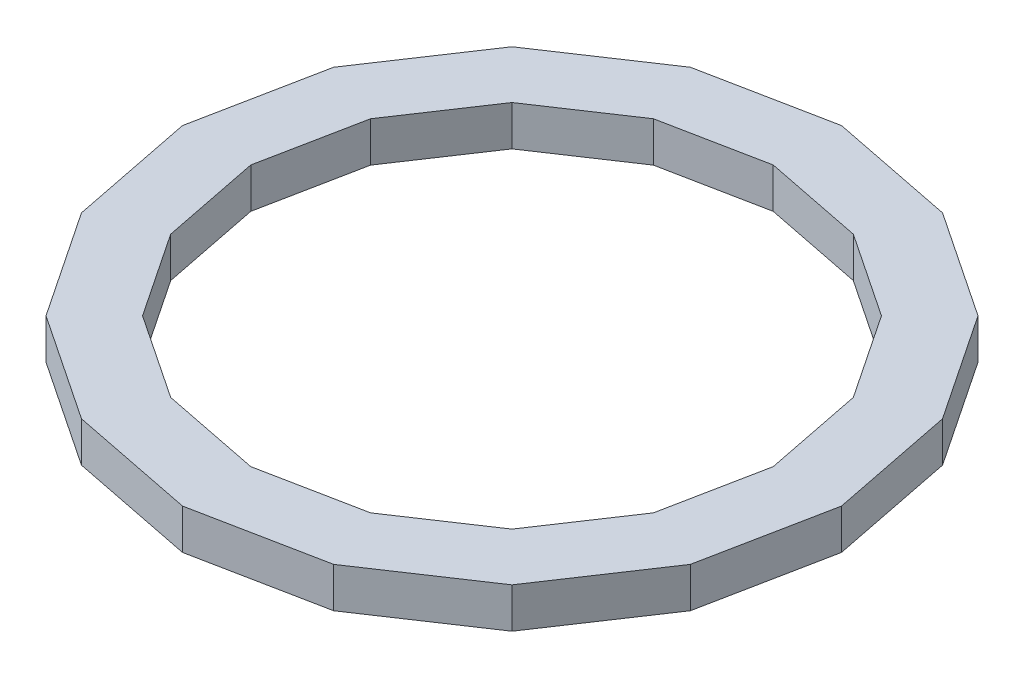
ISO-10303-21;
HEADER;
FILE_DESCRIPTION(('STEP AP214'),'2;1');
FILE_NAME('part.step','',(''),(''),'','','');
FILE_SCHEMA(('AUTOMOTIVE_DESIGN { 1 0 10303 214 1 1 1 1 }'));
ENDSEC;
DATA;
#1=APPLICATION_CONTEXT('core data for automotive mechanical design processes');
#2=APPLICATION_PROTOCOL_DEFINITION('international standard','automotive_design',2000,#1);
#3=PRODUCT_CONTEXT('',#1,'mechanical');
#4=PRODUCT('Part','Part','',(#3));
#5=PRODUCT_RELATED_PRODUCT_CATEGORY('part','',(#4));
#6=PRODUCT_DEFINITION_FORMATION('','',#4);
#7=PRODUCT_DEFINITION_CONTEXT('part definition',#1,'design');
#8=PRODUCT_DEFINITION('design','',#6,#7);
#9=PRODUCT_DEFINITION_SHAPE('','',#8);
#10=(LENGTH_UNIT() NAMED_UNIT(*) SI_UNIT(.MILLI.,.METRE.));
#11=(NAMED_UNIT(*) PLANE_ANGLE_UNIT() SI_UNIT($,.RADIAN.));
#12=(NAMED_UNIT(*) SI_UNIT($,.STERADIAN.) SOLID_ANGLE_UNIT());
#13=UNCERTAINTY_MEASURE_WITH_UNIT(LENGTH_MEASURE(1.E-05),#10,'distance_accuracy_value','');
#14=(GEOMETRIC_REPRESENTATION_CONTEXT(3) GLOBAL_UNCERTAINTY_ASSIGNED_CONTEXT((#13)) GLOBAL_UNIT_ASSIGNED_CONTEXT((#10,
#11,#12)) REPRESENTATION_CONTEXT('',''));
#15=CARTESIAN_POINT('',(0.,0.,0.));
#16=DIRECTION('',(0.,0.,1.));
#17=DIRECTION('',(1.,0.,0.));
#18=AXIS2_PLACEMENT_3D('',#15,#16,#17);
#19=CARTESIAN_POINT('',(0.,19.05,0.));
#20=DIRECTION('',(0.,1.,0.));
#21=DIRECTION('',(0.,0.,1.));
#22=AXIS2_PLACEMENT_3D('',#19,#20,#21);
#23=PLANE('',#22);
#24=DIRECTION('',(0.195090322016117,0.,-0.980785280403233));
#25=VECTOR('',#24,1.);
#26=CARTESIAN_POINT('',(144.34261966422,19.05,59.7886706933793));
#27=LINE('',#26,#25);
#28=CARTESIAN_POINT('',(144.34261966422,19.05,59.7886706933793));
#29=VERTEX_POINT('',#28);
#30=CARTESIAN_POINT('',(156.235325694322,19.05,-1.80066629404927E-12));
#31=VERTEX_POINT('',#30);
#32=EDGE_CURVE('E380',#29,#31,#27,.T.);
#33=ORIENTED_EDGE('',*,*,#32,.T.);
#34=DIRECTION('',(-0.19509032201614,0.,-0.980785280403228));
#35=VECTOR('',#34,1.);
#36=CARTESIAN_POINT('',(156.235325694322,19.05,-1.80066629404927E-12));
#37=LINE('',#36,#35);
#38=CARTESIAN_POINT('',(144.342619664218,19.05,-59.7886706933826));
#39=VERTEX_POINT('',#38);
#40=EDGE_CURVE('E383',#31,#39,#37,.T.);
#41=ORIENTED_EDGE('',*,*,#40,.T.);
#42=DIRECTION('',(-0.555570233019612,0.,-0.831469612302538));
#43=VECTOR('',#42,1.);
#44=CARTESIAN_POINT('',(144.342619664218,19.05,-59.7886706933826));
#45=LINE('',#44,#43);
#46=CARTESIAN_POINT('',(110.475058259343,19.05,-110.475058259345));
#47=VERTEX_POINT('',#46);
#48=EDGE_CURVE('E387',#39,#47,#45,.T.);
#49=ORIENTED_EDGE('',*,*,#48,.T.);
#50=DIRECTION('',(-0.831469612302552,0.,-0.555570233019592));
#51=VECTOR('',#50,1.);
#52=CARTESIAN_POINT('',(110.475058259343,19.05,-110.475058259345));
#53=LINE('',#52,#51);
#54=CARTESIAN_POINT('',(59.7886706933792,19.05,-144.34261966422));
#55=VERTEX_POINT('',#54);
#56=EDGE_CURVE('E389',#47,#55,#53,.T.);
#57=ORIENTED_EDGE('',*,*,#56,.T.);
#58=DIRECTION('',(-0.980785280403233,0.,-0.195090322016117));
#59=VECTOR('',#58,1.);
#60=CARTESIAN_POINT('',(59.7886706933792,19.05,-144.34261966422));
#61=LINE('',#60,#59);
#62=CARTESIAN_POINT('',(-1.8837693537637E-12,19.05,-156.235325694322));
#63=VERTEX_POINT('',#62);
#64=EDGE_CURVE('E392',#55,#63,#61,.T.);
#65=ORIENTED_EDGE('',*,*,#64,.T.);
#66=DIRECTION('',(-0.980785280403228,0.,0.19509032201614));
#67=VECTOR('',#66,1.);
#68=CARTESIAN_POINT('',(-1.8837693537637E-12,19.05,-156.235325694322));
#69=LINE('',#68,#67);
#70=CARTESIAN_POINT('',(-59.7886706933827,19.05,-144.342619664218));
#71=VERTEX_POINT('',#70);
#72=EDGE_CURVE('E394',#63,#71,#69,.T.);
#73=ORIENTED_EDGE('',*,*,#72,.T.);
#74=DIRECTION('',(-0.831469612302539,0.,0.555570233019612));
#75=VECTOR('',#74,1.);
#76=CARTESIAN_POINT('',(-59.7886706933827,19.05,-144.342619664218));
#77=LINE('',#76,#75);
#78=CARTESIAN_POINT('',(-110.475058259345,19.05,-110.475058259343));
#79=VERTEX_POINT('',#78);
#80=EDGE_CURVE('E397',#71,#79,#77,.T.);
#81=ORIENTED_EDGE('',*,*,#80,.T.);
#82=DIRECTION('',(-0.555570233019592,0.,0.831469612302552));
#83=VECTOR('',#82,1.);
#84=CARTESIAN_POINT('',(-110.475058259345,19.05,-110.475058259343));
#85=LINE('',#84,#83);
#86=CARTESIAN_POINT('',(-144.34261966422,19.05,-59.7886706933793));
#87=VERTEX_POINT('',#86);
#88=EDGE_CURVE('E400',#79,#87,#85,.T.);
#89=ORIENTED_EDGE('',*,*,#88,.T.);
#90=DIRECTION('',(-0.195090322016117,0.,0.980785280403233));
#91=VECTOR('',#90,1.);
#92=CARTESIAN_POINT('',(-144.34261966422,19.05,-59.7886706933793));
#93=LINE('',#92,#91);
#94=CARTESIAN_POINT('',(-156.235325694322,19.05,1.85194660434175E-12));
#95=VERTEX_POINT('',#94);
#96=EDGE_CURVE('E402',#87,#95,#93,.T.);
#97=ORIENTED_EDGE('',*,*,#96,.T.);
#98=DIRECTION('',(0.19509032201614,0.,0.980785280403228));
#99=VECTOR('',#98,1.);
#100=CARTESIAN_POINT('',(-156.235325694322,19.05,1.85194660434175E-12));
#101=LINE('',#100,#99);
#102=CARTESIAN_POINT('',(-144.342619664218,19.05,59.7886706933826));
#103=VERTEX_POINT('',#102);
#104=EDGE_CURVE('E405',#95,#103,#101,.T.);
#105=ORIENTED_EDGE('',*,*,#104,.T.);
#106=DIRECTION('',(0.555570233019612,0.,0.831469612302539));
#107=VECTOR('',#106,1.);
#108=CARTESIAN_POINT('',(-144.342619664218,19.05,59.7886706933826));
#109=LINE('',#108,#107);
#110=CARTESIAN_POINT('',(-110.475058259343,19.05,110.475058259345));
#111=VERTEX_POINT('',#110);
#112=EDGE_CURVE('E407',#103,#111,#109,.T.);
#113=ORIENTED_EDGE('',*,*,#112,.T.);
#114=DIRECTION('',(0.831469612302552,0.,0.555570233019592));
#115=VECTOR('',#114,1.);
#116=CARTESIAN_POINT('',(-110.475058259343,19.05,110.475058259345));
#117=LINE('',#116,#115);
#118=CARTESIAN_POINT('',(-59.7886706933793,19.05,144.34261966422));
#119=VERTEX_POINT('',#118);
#120=EDGE_CURVE('E409',#111,#119,#117,.T.);
#121=ORIENTED_EDGE('',*,*,#120,.T.);
#122=DIRECTION('',(0.980785280403233,0.,0.195090322016117));
#123=VECTOR('',#122,1.);
#124=CARTESIAN_POINT('',(-59.7886706933793,19.05,144.34261966422));
#125=LINE('',#124,#123);
#126=CARTESIAN_POINT('',(1.87299293640931E-12,19.05,156.235325694322));
#127=VERTEX_POINT('',#126);
#128=EDGE_CURVE('E411',#119,#127,#125,.T.);
#129=ORIENTED_EDGE('',*,*,#128,.T.);
#130=DIRECTION('',(0.980785280403228,0.,-0.195090322016139));
#131=VECTOR('',#130,1.);
#132=CARTESIAN_POINT('',(1.87299293640931E-12,19.05,156.235325694322));
#133=LINE('',#132,#131);
#134=CARTESIAN_POINT('',(59.7886706933827,19.05,144.342619664218));
#135=VERTEX_POINT('',#134);
#136=EDGE_CURVE('E413',#127,#135,#133,.T.);
#137=ORIENTED_EDGE('',*,*,#136,.T.);
#138=DIRECTION('',(0.831469612302538,0.,-0.555570233019612));
#139=VECTOR('',#138,1.);
#140=CARTESIAN_POINT('',(59.7886706933827,19.05,144.342619664218));
#141=LINE('',#140,#139);
#142=CARTESIAN_POINT('',(110.475058259346,19.05,110.475058259343));
#143=VERTEX_POINT('',#142);
#144=EDGE_CURVE('E415',#135,#143,#141,.T.);
#145=ORIENTED_EDGE('',*,*,#144,.T.);
#146=DIRECTION('',(0.555570233019592,0.,-0.831469612302552));
#147=VECTOR('',#146,1.);
#148=CARTESIAN_POINT('',(110.475058259346,19.05,110.475058259343));
#149=LINE('',#148,#147);
#150=EDGE_CURVE('E418',#143,#29,#149,.T.);
#151=ORIENTED_EDGE('',*,*,#150,.T.);
#152=EDGE_LOOP('',(#33,#41,#49,#57,#65,#73,#81,#89,#97,#105,#113,#121,#129,#137,#145,#151));
#153=FACE_BOUND('',#152,.T.);
#154=DIRECTION('',(-0.19509032201614,0.,-0.980785280403228));
#155=VECTOR('',#154,1.);
#156=CARTESIAN_POINT('',(123.863306421208,19.05,-1.45417488230976E-12));
#157=LINE('',#156,#155);
#158=CARTESIAN_POINT('',(123.863306421208,19.05,-1.45417488230976E-12));
#159=VERTEX_POINT('',#158);
#160=CARTESIAN_POINT('',(114.434773631728,19.05,-47.4004352453582));
#161=VERTEX_POINT('',#160);
#162=EDGE_CURVE('E253',#159,#161,#157,.T.);
#163=ORIENTED_EDGE('',*,*,#162,.F.);
#164=DIRECTION('',(0.195090322016117,0.,-0.980785280403233));
#165=VECTOR('',#164,1.);
#166=CARTESIAN_POINT('',(114.434773631729,19.05,47.4004352453555));
#167=LINE('',#166,#165);
#168=CARTESIAN_POINT('',(114.434773631729,19.05,47.4004352453555));
#169=VERTEX_POINT('',#168);
#170=EDGE_CURVE('E244',#169,#159,#167,.T.);
#171=ORIENTED_EDGE('',*,*,#170,.F.);
#172=DIRECTION('',(0.555570233019592,0.,-0.831469612302552));
#173=VECTOR('',#172,1.);
#174=CARTESIAN_POINT('',(87.5845839106246,19.05,87.5845839106225));
#175=LINE('',#174,#173);
#176=CARTESIAN_POINT('',(87.5845839106247,19.05,87.5845839106225));
#177=VERTEX_POINT('',#176);
#178=EDGE_CURVE('E302',#177,#169,#175,.T.);
#179=ORIENTED_EDGE('',*,*,#178,.F.);
#180=DIRECTION('',(0.831469612302539,0.,-0.555570233019612));
#181=VECTOR('',#180,1.);
#182=CARTESIAN_POINT('',(47.4004352453582,19.05,114.434773631728));
#183=LINE('',#182,#181);
#184=CARTESIAN_POINT('',(47.4004352453582,19.05,114.434773631728));
#185=VERTEX_POINT('',#184);
#186=EDGE_CURVE('E300',#185,#177,#183,.T.);
#187=ORIENTED_EDGE('',*,*,#186,.F.);
#188=DIRECTION('',(0.980785280403228,0.,-0.19509032201614));
#189=VECTOR('',#188,1.);
#190=CARTESIAN_POINT('',(1.47433892365441E-12,19.05,123.863306421208));
#191=LINE('',#190,#189);
#192=CARTESIAN_POINT('',(1.47433892365441E-12,19.05,123.863306421208));
#193=VERTEX_POINT('',#192);
#194=EDGE_CURVE('E298',#193,#185,#191,.T.);
#195=ORIENTED_EDGE('',*,*,#194,.F.);
#196=DIRECTION('',(0.980785280403233,0.,0.195090322016117));
#197=VECTOR('',#196,1.);
#198=CARTESIAN_POINT('',(-47.4004352453554,19.05,114.434773631729));
#199=LINE('',#198,#197);
#200=CARTESIAN_POINT('',(-47.4004352453554,19.05,114.434773631729));
#201=VERTEX_POINT('',#200);
#202=EDGE_CURVE('E296',#201,#193,#199,.T.);
#203=ORIENTED_EDGE('',*,*,#202,.F.);
#204=DIRECTION('',(0.831469612302552,0.,0.555570233019592));
#205=VECTOR('',#204,1.);
#206=CARTESIAN_POINT('',(-87.5845839106225,19.05,87.5845839106246));
#207=LINE('',#206,#205);
#208=CARTESIAN_POINT('',(-87.5845839106225,19.05,87.5845839106246));
#209=VERTEX_POINT('',#208);
#210=EDGE_CURVE('E294',#209,#201,#207,.T.);
#211=ORIENTED_EDGE('',*,*,#210,.F.);
#212=DIRECTION('',(0.555570233019612,0.,0.831469612302539));
#213=VECTOR('',#212,1.);
#214=CARTESIAN_POINT('',(-114.434773631728,19.05,47.4004352453582));
#215=LINE('',#214,#213);
#216=CARTESIAN_POINT('',(-114.434773631728,19.05,47.4004352453582));
#217=VERTEX_POINT('',#216);
#218=EDGE_CURVE('E292',#217,#209,#215,.T.);
#219=ORIENTED_EDGE('',*,*,#218,.F.);
#220=DIRECTION('',(0.19509032201614,0.,0.980785280403228));
#221=VECTOR('',#220,1.);
#222=CARTESIAN_POINT('',(-123.863306421208,19.05,1.48291623966279E-12));
#223=LINE('',#222,#221);
#224=CARTESIAN_POINT('',(-123.863306421208,19.05,1.48291623966279E-12));
#225=VERTEX_POINT('',#224);
#226=EDGE_CURVE('E290',#225,#217,#223,.T.);
#227=ORIENTED_EDGE('',*,*,#226,.F.);
#228=DIRECTION('',(-0.195090322016117,0.,0.980785280403233));
#229=VECTOR('',#228,1.);
#230=CARTESIAN_POINT('',(-114.434773631729,19.05,-47.4004352453555));
#231=LINE('',#230,#229);
#232=CARTESIAN_POINT('',(-114.434773631729,19.05,-47.4004352453555));
#233=VERTEX_POINT('',#232);
#234=EDGE_CURVE('E288',#233,#225,#231,.T.);
#235=ORIENTED_EDGE('',*,*,#234,.F.);
#236=DIRECTION('',(-0.555570233019592,0.,0.831469612302552));
#237=VECTOR('',#236,1.);
#238=CARTESIAN_POINT('',(-87.5845839106246,19.05,-87.5845839106225));
#239=LINE('',#238,#237);
#240=CARTESIAN_POINT('',(-87.5845839106246,19.05,-87.5845839106225));
#241=VERTEX_POINT('',#240);
#242=EDGE_CURVE('E285',#241,#233,#239,.T.);
#243=ORIENTED_EDGE('',*,*,#242,.F.);
#244=DIRECTION('',(-0.831469612302539,0.,0.555570233019612));
#245=VECTOR('',#244,1.);
#246=CARTESIAN_POINT('',(-47.4004352453582,19.05,-114.434773631728));
#247=LINE('',#246,#245);
#248=CARTESIAN_POINT('',(-47.4004352453582,19.05,-114.434773631728));
#249=VERTEX_POINT('',#248);
#250=EDGE_CURVE('E282',#249,#241,#247,.T.);
#251=ORIENTED_EDGE('',*,*,#250,.F.);
#252=DIRECTION('',(-0.980785280403228,0.,0.19509032201614));
#253=VECTOR('',#252,1.);
#254=CARTESIAN_POINT('',(-1.5009018722276E-12,19.05,-123.863306421208));
#255=LINE('',#254,#253);
#256=CARTESIAN_POINT('',(-1.5009018722276E-12,19.05,-123.863306421208));
#257=VERTEX_POINT('',#256);
#258=EDGE_CURVE('E280',#257,#249,#255,.T.);
#259=ORIENTED_EDGE('',*,*,#258,.F.);
#260=DIRECTION('',(-0.980785280403233,0.,-0.195090322016116));
#261=VECTOR('',#260,1.);
#262=CARTESIAN_POINT('',(47.4004352453554,19.05,-114.434773631729));
#263=LINE('',#262,#261);
#264=CARTESIAN_POINT('',(47.4004352453554,19.05,-114.434773631729));
#265=VERTEX_POINT('',#264);
#266=EDGE_CURVE('E277',#265,#257,#263,.T.);
#267=ORIENTED_EDGE('',*,*,#266,.F.);
#268=DIRECTION('',(-0.831469612302552,0.,-0.555570233019593));
#269=VECTOR('',#268,1.);
#270=CARTESIAN_POINT('',(87.5845839106225,19.05,-87.5845839106246));
#271=LINE('',#270,#269);
#272=CARTESIAN_POINT('',(87.5845839106225,19.05,-87.5845839106246));
#273=VERTEX_POINT('',#272);
#274=EDGE_CURVE('E273',#273,#265,#271,.T.);
#275=ORIENTED_EDGE('',*,*,#274,.F.);
#276=DIRECTION('',(-0.555570233019613,0.,-0.831469612302538));
#277=VECTOR('',#276,1.);
#278=CARTESIAN_POINT('',(114.434773631728,19.05,-47.4004352453582));
#279=LINE('',#278,#277);
#280=EDGE_CURVE('E266',#161,#273,#279,.T.);
#281=ORIENTED_EDGE('',*,*,#280,.F.);
#282=EDGE_LOOP('',(#163,#171,#179,#187,#195,#203,#211,#219,#227,#235,#243,#251,#259,#267,#275,#281));
#283=FACE_BOUND('',#282,.T.);
#284=ADVANCED_FACE('F35',(#153,#283),#23,.T.);
#285=CARTESIAN_POINT('',(0.,0.,0.));
#286=DIRECTION('',(0.,1.,0.));
#287=DIRECTION('',(0.,0.,1.));
#288=AXIS2_PLACEMENT_3D('',#285,#286,#287);
#289=PLANE('',#288);
#290=DIRECTION('',(0.195090322016117,0.,-0.980785280403233));
#291=VECTOR('',#290,1.);
#292=CARTESIAN_POINT('',(144.34261966422,0.,59.7886706933793));
#293=LINE('',#292,#291);
#294=CARTESIAN_POINT('',(144.34261966422,0.,59.7886706933793));
#295=VERTEX_POINT('',#294);
#296=CARTESIAN_POINT('',(156.235325694322,0.,-1.80066629404927E-12));
#297=VERTEX_POINT('',#296);
#298=EDGE_CURVE('E261',#295,#297,#293,.T.);
#299=ORIENTED_EDGE('',*,*,#298,.F.);
#300=DIRECTION('',(0.555570233019592,0.,-0.831469612302552));
#301=VECTOR('',#300,1.);
#302=CARTESIAN_POINT('',(110.475058259346,0.,110.475058259343));
#303=LINE('',#302,#301);
#304=CARTESIAN_POINT('',(110.475058259346,0.,110.475058259343));
#305=VERTEX_POINT('',#304);
#306=EDGE_CURVE('E384',#305,#295,#303,.T.);
#307=ORIENTED_EDGE('',*,*,#306,.F.);
#308=DIRECTION('',(0.831469612302538,0.,-0.555570233019612));
#309=VECTOR('',#308,1.);
#310=CARTESIAN_POINT('',(59.7886706933827,0.,144.342619664218));
#311=LINE('',#310,#309);
#312=CARTESIAN_POINT('',(59.7886706933827,0.,144.342619664218));
#313=VERTEX_POINT('',#312);
#314=EDGE_CURVE('E452',#313,#305,#311,.T.);
#315=ORIENTED_EDGE('',*,*,#314,.F.);
#316=DIRECTION('',(0.980785280403228,0.,-0.195090322016139));
#317=VECTOR('',#316,1.);
#318=CARTESIAN_POINT('',(1.87299293640931E-12,0.,156.235325694322));
#319=LINE('',#318,#317);
#320=CARTESIAN_POINT('',(1.87299293640931E-12,0.,156.235325694322));
#321=VERTEX_POINT('',#320);
#322=EDGE_CURVE('E450',#321,#313,#319,.T.);
#323=ORIENTED_EDGE('',*,*,#322,.F.);
#324=DIRECTION('',(0.980785280403233,0.,0.195090322016117));
#325=VECTOR('',#324,1.);
#326=CARTESIAN_POINT('',(-59.7886706933793,0.,144.34261966422));
#327=LINE('',#326,#325);
#328=CARTESIAN_POINT('',(-59.7886706933793,0.,144.34261966422));
#329=VERTEX_POINT('',#328);
#330=EDGE_CURVE('E448',#329,#321,#327,.T.);
#331=ORIENTED_EDGE('',*,*,#330,.F.);
#332=DIRECTION('',(0.831469612302552,0.,0.555570233019592));
#333=VECTOR('',#332,1.);
#334=CARTESIAN_POINT('',(-110.475058259343,0.,110.475058259345));
#335=LINE('',#334,#333);
#336=CARTESIAN_POINT('',(-110.475058259343,0.,110.475058259345));
#337=VERTEX_POINT('',#336);
#338=EDGE_CURVE('E446',#337,#329,#335,.T.);
#339=ORIENTED_EDGE('',*,*,#338,.F.);
#340=DIRECTION('',(0.555570233019612,0.,0.831469612302539));
#341=VECTOR('',#340,1.);
#342=CARTESIAN_POINT('',(-144.342619664218,0.,59.7886706933826));
#343=LINE('',#342,#341);
#344=CARTESIAN_POINT('',(-144.342619664218,0.,59.7886706933826));
#345=VERTEX_POINT('',#344);
#346=EDGE_CURVE('E443',#345,#337,#343,.T.);
#347=ORIENTED_EDGE('',*,*,#346,.F.);
#348=DIRECTION('',(0.19509032201614,0.,0.980785280403228));
#349=VECTOR('',#348,1.);
#350=CARTESIAN_POINT('',(-156.235325694322,0.,1.85194660434175E-12));
#351=LINE('',#350,#349);
#352=CARTESIAN_POINT('',(-156.235325694322,0.,1.85194660434175E-12));
#353=VERTEX_POINT('',#352);
#354=EDGE_CURVE('E441',#353,#345,#351,.T.);
#355=ORIENTED_EDGE('',*,*,#354,.F.);
#356=DIRECTION('',(-0.195090322016117,0.,0.980785280403233));
#357=VECTOR('',#356,1.);
#358=CARTESIAN_POINT('',(-144.34261966422,0.,-59.7886706933793));
#359=LINE('',#358,#357);
#360=CARTESIAN_POINT('',(-144.34261966422,0.,-59.7886706933793));
#361=VERTEX_POINT('',#360);
#362=EDGE_CURVE('E439',#361,#353,#359,.T.);
#363=ORIENTED_EDGE('',*,*,#362,.F.);
#364=DIRECTION('',(-0.555570233019592,0.,0.831469612302552));
#365=VECTOR('',#364,1.);
#366=CARTESIAN_POINT('',(-110.475058259345,0.,-110.475058259343));
#367=LINE('',#366,#365);
#368=CARTESIAN_POINT('',(-110.475058259345,0.,-110.475058259343));
#369=VERTEX_POINT('',#368);
#370=EDGE_CURVE('E436',#369,#361,#367,.T.);
#371=ORIENTED_EDGE('',*,*,#370,.F.);
#372=DIRECTION('',(-0.831469612302539,0.,0.555570233019612));
#373=VECTOR('',#372,1.);
#374=CARTESIAN_POINT('',(-59.7886706933827,0.,-144.342619664218));
#375=LINE('',#374,#373);
#376=CARTESIAN_POINT('',(-59.7886706933827,0.,-144.342619664218));
#377=VERTEX_POINT('',#376);
#378=EDGE_CURVE('E434',#377,#369,#375,.T.);
#379=ORIENTED_EDGE('',*,*,#378,.F.);
#380=DIRECTION('',(-0.980785280403228,0.,0.19509032201614));
#381=VECTOR('',#380,1.);
#382=CARTESIAN_POINT('',(-1.8837693537637E-12,0.,-156.235325694322));
#383=LINE('',#382,#381);
#384=CARTESIAN_POINT('',(-1.8837693537637E-12,0.,-156.235325694322));
#385=VERTEX_POINT('',#384);
#386=EDGE_CURVE('E432',#385,#377,#383,.T.);
#387=ORIENTED_EDGE('',*,*,#386,.F.);
#388=DIRECTION('',(-0.980785280403233,0.,-0.195090322016117));
#389=VECTOR('',#388,1.);
#390=CARTESIAN_POINT('',(59.7886706933792,0.,-144.34261966422));
#391=LINE('',#390,#389);
#392=CARTESIAN_POINT('',(59.7886706933792,0.,-144.34261966422));
#393=VERTEX_POINT('',#392);
#394=EDGE_CURVE('E430',#393,#385,#391,.T.);
#395=ORIENTED_EDGE('',*,*,#394,.F.);
#396=DIRECTION('',(-0.831469612302552,0.,-0.555570233019592));
#397=VECTOR('',#396,1.);
#398=CARTESIAN_POINT('',(110.475058259343,0.,-110.475058259345));
#399=LINE('',#398,#397);
#400=CARTESIAN_POINT('',(110.475058259343,0.,-110.475058259345));
#401=VERTEX_POINT('',#400);
#402=EDGE_CURVE('E428',#401,#393,#399,.T.);
#403=ORIENTED_EDGE('',*,*,#402,.F.);
#404=DIRECTION('',(-0.555570233019612,0.,-0.831469612302538));
#405=VECTOR('',#404,1.);
#406=CARTESIAN_POINT('',(144.342619664218,0.,-59.7886706933826));
#407=LINE('',#406,#405);
#408=CARTESIAN_POINT('',(144.342619664218,0.,-59.7886706933826));
#409=VERTEX_POINT('',#408);
#410=EDGE_CURVE('E425',#409,#401,#407,.T.);
#411=ORIENTED_EDGE('',*,*,#410,.F.);
#412=DIRECTION('',(-0.19509032201614,0.,-0.980785280403228));
#413=VECTOR('',#412,1.);
#414=CARTESIAN_POINT('',(156.235325694322,0.,-1.80066629404927E-12));
#415=LINE('',#414,#413);
#416=EDGE_CURVE('E423',#297,#409,#415,.T.);
#417=ORIENTED_EDGE('',*,*,#416,.F.);
#418=EDGE_LOOP('',(#299,#307,#315,#323,#331,#339,#347,#355,#363,#371,#379,#387,#395,#403,#411,#417));
#419=FACE_BOUND('',#418,.T.);
#420=DIRECTION('',(0.195090322016117,0.,-0.980785280403233));
#421=VECTOR('',#420,1.);
#422=CARTESIAN_POINT('',(114.434773631729,0.,47.4004352453555));
#423=LINE('',#422,#421);
#424=CARTESIAN_POINT('',(114.434773631729,0.,47.4004352453555));
#425=VERTEX_POINT('',#424);
#426=CARTESIAN_POINT('',(123.863306421208,0.,-1.45417488230976E-12));
#427=VERTEX_POINT('',#426);
#428=EDGE_CURVE('E58',#425,#427,#423,.T.);
#429=ORIENTED_EDGE('',*,*,#428,.T.);
#430=DIRECTION('',(-0.19509032201614,0.,-0.980785280403228));
#431=VECTOR('',#430,1.);
#432=CARTESIAN_POINT('',(123.863306421208,0.,-1.45417488230976E-12));
#433=LINE('',#432,#431);
#434=CARTESIAN_POINT('',(114.434773631728,0.,-47.4004352453582));
#435=VERTEX_POINT('',#434);
#436=EDGE_CURVE('E260',#427,#435,#433,.T.);
#437=ORIENTED_EDGE('',*,*,#436,.T.);
#438=DIRECTION('',(-0.555570233019613,0.,-0.831469612302538));
#439=VECTOR('',#438,1.);
#440=CARTESIAN_POINT('',(114.434773631728,0.,-47.4004352453582));
#441=LINE('',#440,#439);
#442=CARTESIAN_POINT('',(87.5845839106225,0.,-87.5845839106246));
#443=VERTEX_POINT('',#442);
#444=EDGE_CURVE('E308',#435,#443,#441,.T.);
#445=ORIENTED_EDGE('',*,*,#444,.T.);
#446=DIRECTION('',(-0.831469612302552,0.,-0.555570233019593));
#447=VECTOR('',#446,1.);
#448=CARTESIAN_POINT('',(87.5845839106225,0.,-87.5845839106246));
#449=LINE('',#448,#447);
#450=CARTESIAN_POINT('',(47.4004352453554,0.,-114.434773631729));
#451=VERTEX_POINT('',#450);
#452=EDGE_CURVE('E312',#443,#451,#449,.T.);
#453=ORIENTED_EDGE('',*,*,#452,.T.);
#454=DIRECTION('',(-0.980785280403233,0.,-0.195090322016116));
#455=VECTOR('',#454,1.);
#456=CARTESIAN_POINT('',(47.4004352453554,0.,-114.434773631729));
#457=LINE('',#456,#455);
#458=CARTESIAN_POINT('',(-1.5009018722276E-12,0.,-123.863306421208));
#459=VERTEX_POINT('',#458);
#460=EDGE_CURVE('E315',#451,#459,#457,.T.);
#461=ORIENTED_EDGE('',*,*,#460,.T.);
#462=DIRECTION('',(-0.980785280403228,0.,0.19509032201614));
#463=VECTOR('',#462,1.);
#464=CARTESIAN_POINT('',(-1.5009018722276E-12,0.,-123.863306421208));
#465=LINE('',#464,#463);
#466=CARTESIAN_POINT('',(-47.4004352453582,0.,-114.434773631728));
#467=VERTEX_POINT('',#466);
#468=EDGE_CURVE('E318',#459,#467,#465,.T.);
#469=ORIENTED_EDGE('',*,*,#468,.T.);
#470=DIRECTION('',(-0.831469612302539,0.,0.555570233019612));
#471=VECTOR('',#470,1.);
#472=CARTESIAN_POINT('',(-47.4004352453582,0.,-114.434773631728));
#473=LINE('',#472,#471);
#474=CARTESIAN_POINT('',(-87.5845839106246,0.,-87.5845839106225));
#475=VERTEX_POINT('',#474);
#476=EDGE_CURVE('E321',#467,#475,#473,.T.);
#477=ORIENTED_EDGE('',*,*,#476,.T.);
#478=DIRECTION('',(-0.555570233019592,0.,0.831469612302552));
#479=VECTOR('',#478,1.);
#480=CARTESIAN_POINT('',(-87.5845839106246,0.,-87.5845839106225));
#481=LINE('',#480,#479);
#482=CARTESIAN_POINT('',(-114.434773631729,0.,-47.4004352453555));
#483=VERTEX_POINT('',#482);
#484=EDGE_CURVE('E324',#475,#483,#481,.T.);
#485=ORIENTED_EDGE('',*,*,#484,.T.);
#486=DIRECTION('',(-0.195090322016117,0.,0.980785280403233));
#487=VECTOR('',#486,1.);
#488=CARTESIAN_POINT('',(-114.434773631729,0.,-47.4004352453555));
#489=LINE('',#488,#487);
#490=CARTESIAN_POINT('',(-123.863306421208,0.,1.48291623966279E-12));
#491=VERTEX_POINT('',#490);
#492=EDGE_CURVE('E327',#483,#491,#489,.T.);
#493=ORIENTED_EDGE('',*,*,#492,.T.);
#494=DIRECTION('',(0.19509032201614,0.,0.980785280403228));
#495=VECTOR('',#494,1.);
#496=CARTESIAN_POINT('',(-123.863306421208,0.,1.48291623966279E-12));
#497=LINE('',#496,#495);
#498=CARTESIAN_POINT('',(-114.434773631728,0.,47.4004352453582));
#499=VERTEX_POINT('',#498);
#500=EDGE_CURVE('E330',#491,#499,#497,.T.);
#501=ORIENTED_EDGE('',*,*,#500,.T.);
#502=DIRECTION('',(0.555570233019612,0.,0.831469612302539));
#503=VECTOR('',#502,1.);
#504=CARTESIAN_POINT('',(-114.434773631728,0.,47.4004352453582));
#505=LINE('',#504,#503);
#506=CARTESIAN_POINT('',(-87.5845839106225,0.,87.5845839106246));
#507=VERTEX_POINT('',#506);
#508=EDGE_CURVE('E333',#499,#507,#505,.T.);
#509=ORIENTED_EDGE('',*,*,#508,.T.);
#510=DIRECTION('',(0.831469612302552,0.,0.555570233019592));
#511=VECTOR('',#510,1.);
#512=CARTESIAN_POINT('',(-87.5845839106225,0.,87.5845839106246));
#513=LINE('',#512,#511);
#514=CARTESIAN_POINT('',(-47.4004352453554,0.,114.434773631729));
#515=VERTEX_POINT('',#514);
#516=EDGE_CURVE('E337',#507,#515,#513,.T.);
#517=ORIENTED_EDGE('',*,*,#516,.T.);
#518=DIRECTION('',(0.980785280403233,0.,0.195090322016117));
#519=VECTOR('',#518,1.);
#520=CARTESIAN_POINT('',(-47.4004352453554,0.,114.434773631729));
#521=LINE('',#520,#519);
#522=CARTESIAN_POINT('',(1.47433892365441E-12,0.,123.863306421208));
#523=VERTEX_POINT('',#522);
#524=EDGE_CURVE('E340',#515,#523,#521,.T.);
#525=ORIENTED_EDGE('',*,*,#524,.T.);
#526=DIRECTION('',(0.980785280403228,0.,-0.19509032201614));
#527=VECTOR('',#526,1.);
#528=CARTESIAN_POINT('',(1.47433892365441E-12,0.,123.863306421208));
#529=LINE('',#528,#527);
#530=CARTESIAN_POINT('',(47.4004352453582,0.,114.434773631728));
#531=VERTEX_POINT('',#530);
#532=EDGE_CURVE('E343',#523,#531,#529,.T.);
#533=ORIENTED_EDGE('',*,*,#532,.T.);
#534=DIRECTION('',(0.831469612302539,0.,-0.555570233019612));
#535=VECTOR('',#534,1.);
#536=CARTESIAN_POINT('',(47.4004352453582,0.,114.434773631728));
#537=LINE('',#536,#535);
#538=CARTESIAN_POINT('',(87.5845839106246,0.,87.5845839106225));
#539=VERTEX_POINT('',#538);
#540=EDGE_CURVE('E346',#531,#539,#537,.T.);
#541=ORIENTED_EDGE('',*,*,#540,.T.);
#542=DIRECTION('',(0.555570233019592,0.,-0.831469612302552));
#543=VECTOR('',#542,1.);
#544=CARTESIAN_POINT('',(87.5845839106246,0.,87.5845839106225));
#545=LINE('',#544,#543);
#546=EDGE_CURVE('E254',#539,#425,#545,.T.);
#547=ORIENTED_EDGE('',*,*,#546,.T.);
#548=EDGE_LOOP('',(#429,#437,#445,#453,#461,#469,#477,#485,#493,#501,#509,#517,#525,#533,#541,#547));
#549=FACE_BOUND('',#548,.T.);
#550=ADVANCED_FACE('F510',(#419,#549),#289,.F.);
#551=CARTESIAN_POINT('',(144.34261966422,19.05,59.7886706933793));
#552=DIRECTION('',(-0.980785280403233,0.,-0.195090322016117));
#553=DIRECTION('',(-0.195090322016117,0.,0.980785280403233));
#554=AXIS2_PLACEMENT_3D('',#551,#552,#553);
#555=PLANE('',#554);
#556=ORIENTED_EDGE('',*,*,#298,.T.);
#557=DIRECTION('',(0.,-1.,0.));
#558=VECTOR('',#557,1.);
#559=CARTESIAN_POINT('',(156.235325694322,19.05,-1.80066629404927E-12));
#560=LINE('',#559,#558);
#561=EDGE_CURVE('E11',#31,#297,#560,.T.);
#562=ORIENTED_EDGE('',*,*,#561,.F.);
#563=ORIENTED_EDGE('',*,*,#32,.F.);
#564=DIRECTION('',(0.,-1.,0.));
#565=VECTOR('',#564,1.);
#566=CARTESIAN_POINT('',(144.34261966422,19.05,59.7886706933793));
#567=LINE('',#566,#565);
#568=EDGE_CURVE('E420',#29,#295,#567,.T.);
#569=ORIENTED_EDGE('',*,*,#568,.T.);
#570=EDGE_LOOP('',(#556,#562,#563,#569));
#571=FACE_BOUND('',#570,.T.);
#572=ADVANCED_FACE('F37',(#571),#555,.F.);
#573=CARTESIAN_POINT('',(156.235325694322,19.05,-1.80066629404927E-12));
#574=DIRECTION('',(-0.980785280403228,0.,0.19509032201614));
#575=DIRECTION('',(0.19509032201614,0.,0.980785280403228));
#576=AXIS2_PLACEMENT_3D('',#573,#574,#575);
#577=PLANE('',#576);
#578=ORIENTED_EDGE('',*,*,#416,.T.);
#579=DIRECTION('',(0.,-1.,0.));
#580=VECTOR('',#579,1.);
#581=CARTESIAN_POINT('',(144.342619664218,19.05,-59.7886706933826));
#582=LINE('',#581,#580);
#583=EDGE_CURVE('E43',#39,#409,#582,.T.);
#584=ORIENTED_EDGE('',*,*,#583,.F.);
#585=ORIENTED_EDGE('',*,*,#40,.F.);
#586=ORIENTED_EDGE('',*,*,#561,.T.);
#587=EDGE_LOOP('',(#578,#584,#585,#586));
#588=FACE_BOUND('',#587,.T.);
#589=ADVANCED_FACE('F527',(#588),#577,.F.);
#590=CARTESIAN_POINT('',(144.342619664218,19.05,-59.7886706933826));
#591=DIRECTION('',(-0.831469612302539,0.,0.555570233019612));
#592=DIRECTION('',(0.555570233019612,0.,0.831469612302539));
#593=AXIS2_PLACEMENT_3D('',#590,#591,#592);
#594=PLANE('',#593);
#595=ORIENTED_EDGE('',*,*,#410,.T.);
#596=DIRECTION('',(0.,-1.,0.));
#597=VECTOR('',#596,1.);
#598=CARTESIAN_POINT('',(110.475058259343,19.05,-110.475058259345));
#599=LINE('',#598,#597);
#600=EDGE_CURVE('E497',#47,#401,#599,.T.);
#601=ORIENTED_EDGE('',*,*,#600,.F.);
#602=ORIENTED_EDGE('',*,*,#48,.F.);
#603=ORIENTED_EDGE('',*,*,#583,.T.);
#604=EDGE_LOOP('',(#595,#601,#602,#603));
#605=FACE_BOUND('',#604,.T.);
#606=ADVANCED_FACE('F504',(#605),#594,.F.);
#607=CARTESIAN_POINT('',(110.475058259343,19.05,-110.475058259345));
#608=DIRECTION('',(-0.555570233019592,0.,0.831469612302552));
#609=DIRECTION('',(0.831469612302552,0.,0.555570233019592));
#610=AXIS2_PLACEMENT_3D('',#607,#608,#609);
#611=PLANE('',#610);
#612=ORIENTED_EDGE('',*,*,#402,.T.);
#613=DIRECTION('',(0.,-1.,0.));
#614=VECTOR('',#613,1.);
#615=CARTESIAN_POINT('',(59.7886706933792,19.05,-144.34261966422));
#616=LINE('',#615,#614);
#617=EDGE_CURVE('E494',#55,#393,#616,.T.);
#618=ORIENTED_EDGE('',*,*,#617,.F.);
#619=ORIENTED_EDGE('',*,*,#56,.F.);
#620=ORIENTED_EDGE('',*,*,#600,.T.);
#621=EDGE_LOOP('',(#612,#618,#619,#620));
#622=FACE_BOUND('',#621,.T.);
#623=ADVANCED_FACE('F516',(#622),#611,.F.);
#624=CARTESIAN_POINT('',(59.7886706933792,19.05,-144.34261966422));
#625=DIRECTION('',(-0.195090322016117,0.,0.980785280403233));
#626=DIRECTION('',(0.980785280403233,0.,0.195090322016117));
#627=AXIS2_PLACEMENT_3D('',#624,#625,#626);
#628=PLANE('',#627);
#629=ORIENTED_EDGE('',*,*,#394,.T.);
#630=DIRECTION('',(0.,-1.,0.));
#631=VECTOR('',#630,1.);
#632=CARTESIAN_POINT('',(-1.8837693537637E-12,19.05,-156.235325694322));
#633=LINE('',#632,#631);
#634=EDGE_CURVE('E490',#63,#385,#633,.T.);
#635=ORIENTED_EDGE('',*,*,#634,.F.);
#636=ORIENTED_EDGE('',*,*,#64,.F.);
#637=ORIENTED_EDGE('',*,*,#617,.T.);
#638=EDGE_LOOP('',(#629,#635,#636,#637));
#639=FACE_BOUND('',#638,.T.);
#640=ADVANCED_FACE('F520',(#639),#628,.F.);
#641=CARTESIAN_POINT('',(-1.8837693537637E-12,19.05,-156.235325694322));
#642=DIRECTION('',(0.19509032201614,0.,0.980785280403228));
#643=DIRECTION('',(0.980785280403228,0.,-0.19509032201614));
#644=AXIS2_PLACEMENT_3D('',#641,#642,#643);
#645=PLANE('',#644);
#646=ORIENTED_EDGE('',*,*,#386,.T.);
#647=DIRECTION('',(0.,-1.,0.));
#648=VECTOR('',#647,1.);
#649=CARTESIAN_POINT('',(-59.7886706933827,19.05,-144.342619664218));
#650=LINE('',#649,#648);
#651=EDGE_CURVE('E486',#71,#377,#650,.T.);
#652=ORIENTED_EDGE('',*,*,#651,.F.);
#653=ORIENTED_EDGE('',*,*,#72,.F.);
#654=ORIENTED_EDGE('',*,*,#634,.T.);
#655=EDGE_LOOP('',(#646,#652,#653,#654));
#656=FACE_BOUND('',#655,.T.);
#657=ADVANCED_FACE('F580',(#656),#645,.F.);
#658=CARTESIAN_POINT('',(-59.7886706933827,19.05,-144.342619664218));
#659=DIRECTION('',(0.555570233019612,0.,0.831469612302539));
#660=DIRECTION('',(0.831469612302539,0.,-0.555570233019612));
#661=AXIS2_PLACEMENT_3D('',#658,#659,#660);
#662=PLANE('',#661);
#663=ORIENTED_EDGE('',*,*,#378,.T.);
#664=DIRECTION('',(0.,-1.,0.));
#665=VECTOR('',#664,1.);
#666=CARTESIAN_POINT('',(-110.475058259345,19.05,-110.475058259343));
#667=LINE('',#666,#665);
#668=EDGE_CURVE('E483',#79,#369,#667,.T.);
#669=ORIENTED_EDGE('',*,*,#668,.F.);
#670=ORIENTED_EDGE('',*,*,#80,.F.);
#671=ORIENTED_EDGE('',*,*,#651,.T.);
#672=EDGE_LOOP('',(#663,#669,#670,#671));
#673=FACE_BOUND('',#672,.T.);
#674=ADVANCED_FACE('F577',(#673),#662,.F.);
#675=CARTESIAN_POINT('',(-110.475058259345,19.05,-110.475058259343));
#676=DIRECTION('',(0.831469612302552,0.,0.555570233019592));
#677=DIRECTION('',(0.555570233019592,0.,-0.831469612302552));
#678=AXIS2_PLACEMENT_3D('',#675,#676,#677);
#679=PLANE('',#678);
#680=ORIENTED_EDGE('',*,*,#370,.T.);
#681=DIRECTION('',(0.,-1.,0.));
#682=VECTOR('',#681,1.);
#683=CARTESIAN_POINT('',(-144.34261966422,19.05,-59.7886706933793));
#684=LINE('',#683,#682);
#685=EDGE_CURVE('E479',#87,#361,#684,.T.);
#686=ORIENTED_EDGE('',*,*,#685,.F.);
#687=ORIENTED_EDGE('',*,*,#88,.F.);
#688=ORIENTED_EDGE('',*,*,#668,.T.);
#689=EDGE_LOOP('',(#680,#686,#687,#688));
#690=FACE_BOUND('',#689,.T.);
#691=ADVANCED_FACE('F573',(#690),#679,.F.);
#692=CARTESIAN_POINT('',(-144.34261966422,19.05,-59.7886706933793));
#693=DIRECTION('',(0.980785280403233,0.,0.195090322016117));
#694=DIRECTION('',(0.195090322016117,0.,-0.980785280403233));
#695=AXIS2_PLACEMENT_3D('',#692,#693,#694);
#696=PLANE('',#695);
#697=ORIENTED_EDGE('',*,*,#362,.T.);
#698=DIRECTION('',(0.,-1.,0.));
#699=VECTOR('',#698,1.);
#700=CARTESIAN_POINT('',(-156.235325694322,19.05,1.85194660434175E-12));
#701=LINE('',#700,#699);
#702=EDGE_CURVE('E476',#95,#353,#701,.T.);
#703=ORIENTED_EDGE('',*,*,#702,.F.);
#704=ORIENTED_EDGE('',*,*,#96,.F.);
#705=ORIENTED_EDGE('',*,*,#685,.T.);
#706=EDGE_LOOP('',(#697,#703,#704,#705));
#707=FACE_BOUND('',#706,.T.);
#708=ADVANCED_FACE('F569',(#707),#696,.F.);
#709=CARTESIAN_POINT('',(-156.235325694322,19.05,1.85194660434175E-12));
#710=DIRECTION('',(0.980785280403228,0.,-0.19509032201614));
#711=DIRECTION('',(-0.19509032201614,0.,-0.980785280403228));
#712=AXIS2_PLACEMENT_3D('',#709,#710,#711);
#713=PLANE('',#712);
#714=ORIENTED_EDGE('',*,*,#354,.T.);
#715=DIRECTION('',(0.,-1.,0.));
#716=VECTOR('',#715,1.);
#717=CARTESIAN_POINT('',(-144.342619664218,19.05,59.7886706933826));
#718=LINE('',#717,#716);
#719=EDGE_CURVE('E473',#103,#345,#718,.T.);
#720=ORIENTED_EDGE('',*,*,#719,.F.);
#721=ORIENTED_EDGE('',*,*,#104,.F.);
#722=ORIENTED_EDGE('',*,*,#702,.T.);
#723=EDGE_LOOP('',(#714,#720,#721,#722));
#724=FACE_BOUND('',#723,.T.);
#725=ADVANCED_FACE('F564',(#724),#713,.F.);
#726=CARTESIAN_POINT('',(-144.342619664218,19.05,59.7886706933826));
#727=DIRECTION('',(0.831469612302539,0.,-0.555570233019612));
#728=DIRECTION('',(-0.555570233019612,0.,-0.831469612302539));
#729=AXIS2_PLACEMENT_3D('',#726,#727,#728);
#730=PLANE('',#729);
#731=ORIENTED_EDGE('',*,*,#346,.T.);
#732=DIRECTION('',(0.,-1.,0.));
#733=VECTOR('',#732,1.);
#734=CARTESIAN_POINT('',(-110.475058259343,19.05,110.475058259345));
#735=LINE('',#734,#733);
#736=EDGE_CURVE('E470',#111,#337,#735,.T.);
#737=ORIENTED_EDGE('',*,*,#736,.F.);
#738=ORIENTED_EDGE('',*,*,#112,.F.);
#739=ORIENTED_EDGE('',*,*,#719,.T.);
#740=EDGE_LOOP('',(#731,#737,#738,#739));
#741=FACE_BOUND('',#740,.T.);
#742=ADVANCED_FACE('F558',(#741),#730,.F.);
#743=CARTESIAN_POINT('',(-110.475058259343,19.05,110.475058259345));
#744=DIRECTION('',(0.555570233019592,0.,-0.831469612302552));
#745=DIRECTION('',(-0.831469612302552,0.,-0.555570233019592));
#746=AXIS2_PLACEMENT_3D('',#743,#744,#745);
#747=PLANE('',#746);
#748=ORIENTED_EDGE('',*,*,#338,.T.);
#749=DIRECTION('',(0.,-1.,0.));
#750=VECTOR('',#749,1.);
#751=CARTESIAN_POINT('',(-59.7886706933793,19.05,144.34261966422));
#752=LINE('',#751,#750);
#753=EDGE_CURVE('E467',#119,#329,#752,.T.);
#754=ORIENTED_EDGE('',*,*,#753,.F.);
#755=ORIENTED_EDGE('',*,*,#120,.F.);
#756=ORIENTED_EDGE('',*,*,#736,.T.);
#757=EDGE_LOOP('',(#748,#754,#755,#756));
#758=FACE_BOUND('',#757,.T.);
#759=ADVANCED_FACE('F554',(#758),#747,.F.);
#760=CARTESIAN_POINT('',(-59.7886706933793,19.05,144.34261966422));
#761=DIRECTION('',(0.195090322016117,0.,-0.980785280403233));
#762=DIRECTION('',(-0.980785280403233,0.,-0.195090322016117));
#763=AXIS2_PLACEMENT_3D('',#760,#761,#762);
#764=PLANE('',#763);
#765=ORIENTED_EDGE('',*,*,#330,.T.);
#766=DIRECTION('',(0.,-1.,0.));
#767=VECTOR('',#766,1.);
#768=CARTESIAN_POINT('',(1.87299293640931E-12,19.05,156.235325694322));
#769=LINE('',#768,#767);
#770=EDGE_CURVE('E464',#127,#321,#769,.T.);
#771=ORIENTED_EDGE('',*,*,#770,.F.);
#772=ORIENTED_EDGE('',*,*,#128,.F.);
#773=ORIENTED_EDGE('',*,*,#753,.T.);
#774=EDGE_LOOP('',(#765,#771,#772,#773));
#775=FACE_BOUND('',#774,.T.);
#776=ADVANCED_FACE('F549',(#775),#764,.F.);
#777=CARTESIAN_POINT('',(1.87299293640931E-12,19.05,156.235325694322));
#778=DIRECTION('',(-0.195090322016139,0.,-0.980785280403228));
#779=DIRECTION('',(-0.980785280403228,0.,0.195090322016139));
#780=AXIS2_PLACEMENT_3D('',#777,#778,#779);
#781=PLANE('',#780);
#782=ORIENTED_EDGE('',*,*,#322,.T.);
#783=DIRECTION('',(0.,-1.,0.));
#784=VECTOR('',#783,1.);
#785=CARTESIAN_POINT('',(59.7886706933827,19.05,144.342619664218));
#786=LINE('',#785,#784);
#787=EDGE_CURVE('E461',#135,#313,#786,.T.);
#788=ORIENTED_EDGE('',*,*,#787,.F.);
#789=ORIENTED_EDGE('',*,*,#136,.F.);
#790=ORIENTED_EDGE('',*,*,#770,.T.);
#791=EDGE_LOOP('',(#782,#788,#789,#790));
#792=FACE_BOUND('',#791,.T.);
#793=ADVANCED_FACE('F543',(#792),#781,.F.);
#794=CARTESIAN_POINT('',(59.7886706933827,19.05,144.342619664218));
#795=DIRECTION('',(-0.555570233019612,0.,-0.831469612302539));
#796=DIRECTION('',(-0.831469612302539,0.,0.555570233019612));
#797=AXIS2_PLACEMENT_3D('',#794,#795,#796);
#798=PLANE('',#797);
#799=ORIENTED_EDGE('',*,*,#314,.T.);
#800=DIRECTION('',(0.,-1.,0.));
#801=VECTOR('',#800,1.);
#802=CARTESIAN_POINT('',(110.475058259346,19.05,110.475058259343));
#803=LINE('',#802,#801);
#804=EDGE_CURVE('E458',#143,#305,#803,.T.);
#805=ORIENTED_EDGE('',*,*,#804,.F.);
#806=ORIENTED_EDGE('',*,*,#144,.F.);
#807=ORIENTED_EDGE('',*,*,#787,.T.);
#808=EDGE_LOOP('',(#799,#805,#806,#807));
#809=FACE_BOUND('',#808,.T.);
#810=ADVANCED_FACE('F539',(#809),#798,.F.);
#811=CARTESIAN_POINT('',(110.475058259346,19.05,110.475058259343));
#812=DIRECTION('',(-0.831469612302552,0.,-0.555570233019592));
#813=DIRECTION('',(-0.555570233019592,0.,0.831469612302552));
#814=AXIS2_PLACEMENT_3D('',#811,#812,#813);
#815=PLANE('',#814);
#816=ORIENTED_EDGE('',*,*,#306,.T.);
#817=ORIENTED_EDGE('',*,*,#568,.F.);
#818=ORIENTED_EDGE('',*,*,#150,.F.);
#819=ORIENTED_EDGE('',*,*,#804,.T.);
#820=EDGE_LOOP('',(#816,#817,#818,#819));
#821=FACE_BOUND('',#820,.T.);
#822=ADVANCED_FACE('F534',(#821),#815,.F.);
#823=CARTESIAN_POINT('',(114.434773631729,19.05,47.4004352453555));
#824=DIRECTION('',(-0.980785280403233,0.,-0.195090322016116));
#825=DIRECTION('',(-0.195090322016116,0.,0.980785280403233));
#826=AXIS2_PLACEMENT_3D('',#823,#824,#825);
#827=PLANE('',#826);
#828=ORIENTED_EDGE('',*,*,#428,.F.);
#829=DIRECTION('',(0.,-1.,0.));
#830=VECTOR('',#829,1.);
#831=CARTESIAN_POINT('',(114.434773631729,19.05,47.4004352453555));
#832=LINE('',#831,#830);
#833=EDGE_CURVE('E248',#169,#425,#832,.T.);
#834=ORIENTED_EDGE('',*,*,#833,.F.);
#835=ORIENTED_EDGE('',*,*,#170,.T.);
#836=DIRECTION('',(0.,-1.,0.));
#837=VECTOR('',#836,1.);
#838=CARTESIAN_POINT('',(123.863306421208,19.05,-1.45417488230976E-12));
#839=LINE('',#838,#837);
#840=EDGE_CURVE('E247',#159,#427,#839,.T.);
#841=ORIENTED_EDGE('',*,*,#840,.T.);
#842=EDGE_LOOP('',(#828,#834,#835,#841));
#843=FACE_BOUND('',#842,.T.);
#844=ADVANCED_FACE('F246',(#843),#827,.T.);
#845=CARTESIAN_POINT('',(123.863306421208,19.05,-1.45417488230976E-12));
#846=DIRECTION('',(-0.980785280403228,0.,0.19509032201614));
#847=DIRECTION('',(0.19509032201614,0.,0.980785280403228));
#848=AXIS2_PLACEMENT_3D('',#845,#846,#847);
#849=PLANE('',#848);
#850=ORIENTED_EDGE('',*,*,#436,.F.);
#851=ORIENTED_EDGE('',*,*,#840,.F.);
#852=ORIENTED_EDGE('',*,*,#162,.T.);
#853=DIRECTION('',(0.,-1.,0.));
#854=VECTOR('',#853,1.);
#855=CARTESIAN_POINT('',(114.434773631728,19.05,-47.4004352453582));
#856=LINE('',#855,#854);
#857=EDGE_CURVE('E262',#161,#435,#856,.T.);
#858=ORIENTED_EDGE('',*,*,#857,.T.);
#859=EDGE_LOOP('',(#850,#851,#852,#858));
#860=FACE_BOUND('',#859,.T.);
#861=ADVANCED_FACE('F257',(#860),#849,.T.);
#862=CARTESIAN_POINT('',(114.434773631728,19.05,-47.4004352453582));
#863=DIRECTION('',(-0.831469612302538,0.,0.555570233019613));
#864=DIRECTION('',(0.555570233019613,0.,0.831469612302538));
#865=AXIS2_PLACEMENT_3D('',#862,#863,#864);
#866=PLANE('',#865);
#867=ORIENTED_EDGE('',*,*,#444,.F.);
#868=ORIENTED_EDGE('',*,*,#857,.F.);
#869=ORIENTED_EDGE('',*,*,#280,.T.);
#870=DIRECTION('',(0.,-1.,0.));
#871=VECTOR('',#870,1.);
#872=CARTESIAN_POINT('',(87.5845839106225,19.05,-87.5845839106246));
#873=LINE('',#872,#871);
#874=EDGE_CURVE('E375',#273,#443,#873,.T.);
#875=ORIENTED_EDGE('',*,*,#874,.T.);
#876=EDGE_LOOP('',(#867,#868,#869,#875));
#877=FACE_BOUND('',#876,.T.);
#878=ADVANCED_FACE('F662',(#877),#866,.T.);
#879=CARTESIAN_POINT('',(87.5845839106225,19.05,-87.5845839106246));
#880=DIRECTION('',(-0.555570233019592,0.,0.831469612302552));
#881=DIRECTION('',(0.831469612302552,0.,0.555570233019593));
#882=AXIS2_PLACEMENT_3D('',#879,#880,#881);
#883=PLANE('',#882);
#884=ORIENTED_EDGE('',*,*,#452,.F.);
#885=ORIENTED_EDGE('',*,*,#874,.F.);
#886=ORIENTED_EDGE('',*,*,#274,.T.);
#887=DIRECTION('',(0.,-1.,0.));
#888=VECTOR('',#887,1.);
#889=CARTESIAN_POINT('',(47.4004352453554,19.05,-114.434773631729));
#890=LINE('',#889,#888);
#891=EDGE_CURVE('E373',#265,#451,#890,.T.);
#892=ORIENTED_EDGE('',*,*,#891,.T.);
#893=EDGE_LOOP('',(#884,#885,#886,#892));
#894=FACE_BOUND('',#893,.T.);
#895=ADVANCED_FACE('F668',(#894),#883,.T.);
#896=CARTESIAN_POINT('',(47.4004352453554,19.05,-114.434773631729));
#897=DIRECTION('',(-0.195090322016116,0.,0.980785280403233));
#898=DIRECTION('',(0.980785280403233,0.,0.195090322016116));
#899=AXIS2_PLACEMENT_3D('',#896,#897,#898);
#900=PLANE('',#899);
#901=ORIENTED_EDGE('',*,*,#460,.F.);
#902=ORIENTED_EDGE('',*,*,#891,.F.);
#903=ORIENTED_EDGE('',*,*,#266,.T.);
#904=DIRECTION('',(0.,-1.,0.));
#905=VECTOR('',#904,1.);
#906=CARTESIAN_POINT('',(-1.5009018722276E-12,19.05,-123.863306421208));
#907=LINE('',#906,#905);
#908=EDGE_CURVE('E371',#257,#459,#907,.T.);
#909=ORIENTED_EDGE('',*,*,#908,.T.);
#910=EDGE_LOOP('',(#901,#902,#903,#909));
#911=FACE_BOUND('',#910,.T.);
#912=ADVANCED_FACE('F676',(#911),#900,.T.);
#913=CARTESIAN_POINT('',(-1.5009018722276E-12,19.05,-123.863306421208));
#914=DIRECTION('',(0.19509032201614,0.,0.980785280403228));
#915=DIRECTION('',(0.980785280403228,0.,-0.19509032201614));
#916=AXIS2_PLACEMENT_3D('',#913,#914,#915);
#917=PLANE('',#916);
#918=ORIENTED_EDGE('',*,*,#468,.F.);
#919=ORIENTED_EDGE('',*,*,#908,.F.);
#920=ORIENTED_EDGE('',*,*,#258,.T.);
#921=DIRECTION('',(0.,-1.,0.));
#922=VECTOR('',#921,1.);
#923=CARTESIAN_POINT('',(-47.4004352453582,19.05,-114.434773631728));
#924=LINE('',#923,#922);
#925=EDGE_CURVE('E369',#249,#467,#924,.T.);
#926=ORIENTED_EDGE('',*,*,#925,.T.);
#927=EDGE_LOOP('',(#918,#919,#920,#926));
#928=FACE_BOUND('',#927,.T.);
#929=ADVANCED_FACE('F684',(#928),#917,.T.);
#930=CARTESIAN_POINT('',(-47.4004352453582,19.05,-114.434773631728));
#931=DIRECTION('',(0.555570233019612,0.,0.831469612302539));
#932=DIRECTION('',(0.831469612302539,0.,-0.555570233019612));
#933=AXIS2_PLACEMENT_3D('',#930,#931,#932);
#934=PLANE('',#933);
#935=ORIENTED_EDGE('',*,*,#476,.F.);
#936=ORIENTED_EDGE('',*,*,#925,.F.);
#937=ORIENTED_EDGE('',*,*,#250,.T.);
#938=DIRECTION('',(0.,-1.,0.));
#939=VECTOR('',#938,1.);
#940=CARTESIAN_POINT('',(-87.5845839106246,19.05,-87.5845839106225));
#941=LINE('',#940,#939);
#942=EDGE_CURVE('E367',#241,#475,#941,.T.);
#943=ORIENTED_EDGE('',*,*,#942,.T.);
#944=EDGE_LOOP('',(#935,#936,#937,#943));
#945=FACE_BOUND('',#944,.T.);
#946=ADVANCED_FACE('F692',(#945),#934,.T.);
#947=CARTESIAN_POINT('',(-87.5845839106246,19.05,-87.5845839106225));
#948=DIRECTION('',(0.831469612302552,0.,0.555570233019592));
#949=DIRECTION('',(0.555570233019592,0.,-0.831469612302552));
#950=AXIS2_PLACEMENT_3D('',#947,#948,#949);
#951=PLANE('',#950);
#952=ORIENTED_EDGE('',*,*,#484,.F.);
#953=ORIENTED_EDGE('',*,*,#942,.F.);
#954=ORIENTED_EDGE('',*,*,#242,.T.);
#955=DIRECTION('',(0.,-1.,0.));
#956=VECTOR('',#955,1.);
#957=CARTESIAN_POINT('',(-114.434773631729,19.05,-47.4004352453555));
#958=LINE('',#957,#956);
#959=EDGE_CURVE('E365',#233,#483,#958,.T.);
#960=ORIENTED_EDGE('',*,*,#959,.T.);
#961=EDGE_LOOP('',(#952,#953,#954,#960));
#962=FACE_BOUND('',#961,.T.);
#963=ADVANCED_FACE('F700',(#962),#951,.T.);
#964=CARTESIAN_POINT('',(-114.434773631729,19.05,-47.4004352453555));
#965=DIRECTION('',(0.980785280403233,0.,0.195090322016116));
#966=DIRECTION('',(0.195090322016116,0.,-0.980785280403233));
#967=AXIS2_PLACEMENT_3D('',#964,#965,#966);
#968=PLANE('',#967);
#969=ORIENTED_EDGE('',*,*,#492,.F.);
#970=ORIENTED_EDGE('',*,*,#959,.F.);
#971=ORIENTED_EDGE('',*,*,#234,.T.);
#972=DIRECTION('',(0.,-1.,0.));
#973=VECTOR('',#972,1.);
#974=CARTESIAN_POINT('',(-123.863306421208,19.05,1.48291623966279E-12));
#975=LINE('',#974,#973);
#976=EDGE_CURVE('E363',#225,#491,#975,.T.);
#977=ORIENTED_EDGE('',*,*,#976,.T.);
#978=EDGE_LOOP('',(#969,#970,#971,#977));
#979=FACE_BOUND('',#978,.T.);
#980=ADVANCED_FACE('F708',(#979),#968,.T.);
#981=CARTESIAN_POINT('',(-123.863306421208,19.05,1.48291623966279E-12));
#982=DIRECTION('',(0.980785280403228,0.,-0.19509032201614));
#983=DIRECTION('',(-0.19509032201614,0.,-0.980785280403228));
#984=AXIS2_PLACEMENT_3D('',#981,#982,#983);
#985=PLANE('',#984);
#986=ORIENTED_EDGE('',*,*,#500,.F.);
#987=ORIENTED_EDGE('',*,*,#976,.F.);
#988=ORIENTED_EDGE('',*,*,#226,.T.);
#989=DIRECTION('',(0.,-1.,0.));
#990=VECTOR('',#989,1.);
#991=CARTESIAN_POINT('',(-114.434773631728,19.05,47.4004352453582));
#992=LINE('',#991,#990);
#993=EDGE_CURVE('E361',#217,#499,#992,.T.);
#994=ORIENTED_EDGE('',*,*,#993,.T.);
#995=EDGE_LOOP('',(#986,#987,#988,#994));
#996=FACE_BOUND('',#995,.T.);
#997=ADVANCED_FACE('F716',(#996),#985,.T.);
#998=CARTESIAN_POINT('',(-114.434773631728,19.05,47.4004352453582));
#999=DIRECTION('',(0.831469612302539,0.,-0.555570233019612));
#1000=DIRECTION('',(-0.555570233019612,0.,-0.831469612302539));
#1001=AXIS2_PLACEMENT_3D('',#998,#999,#1000);
#1002=PLANE('',#1001);
#1003=ORIENTED_EDGE('',*,*,#508,.F.);
#1004=ORIENTED_EDGE('',*,*,#993,.F.);
#1005=ORIENTED_EDGE('',*,*,#218,.T.);
#1006=DIRECTION('',(0.,-1.,0.));
#1007=VECTOR('',#1006,1.);
#1008=CARTESIAN_POINT('',(-87.5845839106225,19.05,87.5845839106246));
#1009=LINE('',#1008,#1007);
#1010=EDGE_CURVE('E359',#209,#507,#1009,.T.);
#1011=ORIENTED_EDGE('',*,*,#1010,.T.);
#1012=EDGE_LOOP('',(#1003,#1004,#1005,#1011));
#1013=FACE_BOUND('',#1012,.T.);
#1014=ADVANCED_FACE('F724',(#1013),#1002,.T.);
#1015=CARTESIAN_POINT('',(-87.5845839106225,19.05,87.5845839106246));
#1016=DIRECTION('',(0.555570233019592,0.,-0.831469612302552));
#1017=DIRECTION('',(-0.831469612302552,0.,-0.555570233019592));
#1018=AXIS2_PLACEMENT_3D('',#1015,#1016,#1017);
#1019=PLANE('',#1018);
#1020=ORIENTED_EDGE('',*,*,#516,.F.);
#1021=ORIENTED_EDGE('',*,*,#1010,.F.);
#1022=ORIENTED_EDGE('',*,*,#210,.T.);
#1023=DIRECTION('',(0.,-1.,0.));
#1024=VECTOR('',#1023,1.);
#1025=CARTESIAN_POINT('',(-47.4004352453554,19.05,114.434773631729));
#1026=LINE('',#1025,#1024);
#1027=EDGE_CURVE('E357',#201,#515,#1026,.T.);
#1028=ORIENTED_EDGE('',*,*,#1027,.T.);
#1029=EDGE_LOOP('',(#1020,#1021,#1022,#1028));
#1030=FACE_BOUND('',#1029,.T.);
#1031=ADVANCED_FACE('F732',(#1030),#1019,.T.);
#1032=CARTESIAN_POINT('',(-47.4004352453554,19.05,114.434773631729));
#1033=DIRECTION('',(0.195090322016117,0.,-0.980785280403233));
#1034=DIRECTION('',(-0.980785280403233,0.,-0.195090322016117));
#1035=AXIS2_PLACEMENT_3D('',#1032,#1033,#1034);
#1036=PLANE('',#1035);
#1037=ORIENTED_EDGE('',*,*,#524,.F.);
#1038=ORIENTED_EDGE('',*,*,#1027,.F.);
#1039=ORIENTED_EDGE('',*,*,#202,.T.);
#1040=DIRECTION('',(0.,-1.,0.));
#1041=VECTOR('',#1040,1.);
#1042=CARTESIAN_POINT('',(1.47433892365441E-12,19.05,123.863306421208));
#1043=LINE('',#1042,#1041);
#1044=EDGE_CURVE('E355',#193,#523,#1043,.T.);
#1045=ORIENTED_EDGE('',*,*,#1044,.T.);
#1046=EDGE_LOOP('',(#1037,#1038,#1039,#1045));
#1047=FACE_BOUND('',#1046,.T.);
#1048=ADVANCED_FACE('F740',(#1047),#1036,.T.);
#1049=CARTESIAN_POINT('',(1.47433892365441E-12,19.05,123.863306421208));
#1050=DIRECTION('',(-0.19509032201614,0.,-0.980785280403228));
#1051=DIRECTION('',(-0.980785280403228,0.,0.19509032201614));
#1052=AXIS2_PLACEMENT_3D('',#1049,#1050,#1051);
#1053=PLANE('',#1052);
#1054=ORIENTED_EDGE('',*,*,#532,.F.);
#1055=ORIENTED_EDGE('',*,*,#1044,.F.);
#1056=ORIENTED_EDGE('',*,*,#194,.T.);
#1057=DIRECTION('',(0.,-1.,0.));
#1058=VECTOR('',#1057,1.);
#1059=CARTESIAN_POINT('',(47.4004352453582,19.05,114.434773631728));
#1060=LINE('',#1059,#1058);
#1061=EDGE_CURVE('E353',#185,#531,#1060,.T.);
#1062=ORIENTED_EDGE('',*,*,#1061,.T.);
#1063=EDGE_LOOP('',(#1054,#1055,#1056,#1062));
#1064=FACE_BOUND('',#1063,.T.);
#1065=ADVANCED_FACE('F748',(#1064),#1053,.T.);
#1066=CARTESIAN_POINT('',(47.4004352453582,19.05,114.434773631728));
#1067=DIRECTION('',(-0.555570233019612,0.,-0.831469612302539));
#1068=DIRECTION('',(-0.831469612302539,0.,0.555570233019612));
#1069=AXIS2_PLACEMENT_3D('',#1066,#1067,#1068);
#1070=PLANE('',#1069);
#1071=ORIENTED_EDGE('',*,*,#540,.F.);
#1072=ORIENTED_EDGE('',*,*,#1061,.F.);
#1073=ORIENTED_EDGE('',*,*,#186,.T.);
#1074=DIRECTION('',(0.,-1.,0.));
#1075=VECTOR('',#1074,1.);
#1076=CARTESIAN_POINT('',(87.5845839106246,19.05,87.5845839106225));
#1077=LINE('',#1076,#1075);
#1078=EDGE_CURVE('E50',#177,#539,#1077,.T.);
#1079=ORIENTED_EDGE('',*,*,#1078,.T.);
#1080=EDGE_LOOP('',(#1071,#1072,#1073,#1079));
#1081=FACE_BOUND('',#1080,.T.);
#1082=ADVANCED_FACE('F756',(#1081),#1070,.T.);
#1083=CARTESIAN_POINT('',(87.5845839106246,19.05,87.5845839106225));
#1084=DIRECTION('',(-0.831469612302552,0.,-0.555570233019592));
#1085=DIRECTION('',(-0.555570233019592,0.,0.831469612302552));
#1086=AXIS2_PLACEMENT_3D('',#1083,#1084,#1085);
#1087=PLANE('',#1086);
#1088=ORIENTED_EDGE('',*,*,#546,.F.);
#1089=ORIENTED_EDGE('',*,*,#1078,.F.);
#1090=ORIENTED_EDGE('',*,*,#178,.T.);
#1091=ORIENTED_EDGE('',*,*,#833,.T.);
#1092=EDGE_LOOP('',(#1088,#1089,#1090,#1091));
#1093=FACE_BOUND('',#1092,.T.);
#1094=ADVANCED_FACE('F764',(#1093),#1087,.T.);
#1095=CLOSED_SHELL('',(#284,#550,#572,#589,#606,#623,#640,#657,#674,#691,#708,#725,#742,#759,
#776,#793,#810,#822,#844,#861,#878,#895,#912,#929,#946,#963,#980,#997,#1014,#1031,#1048,#1065,
#1082,#1094));
#1096=MANIFOLD_SOLID_BREP('B2',#1095);
#1097=ADVANCED_BREP_SHAPE_REPRESENTATION('',(#18,#1096),#14);
#1098=SHAPE_DEFINITION_REPRESENTATION(#9,#1097);
ENDSEC;
END-ISO-10303-21;
